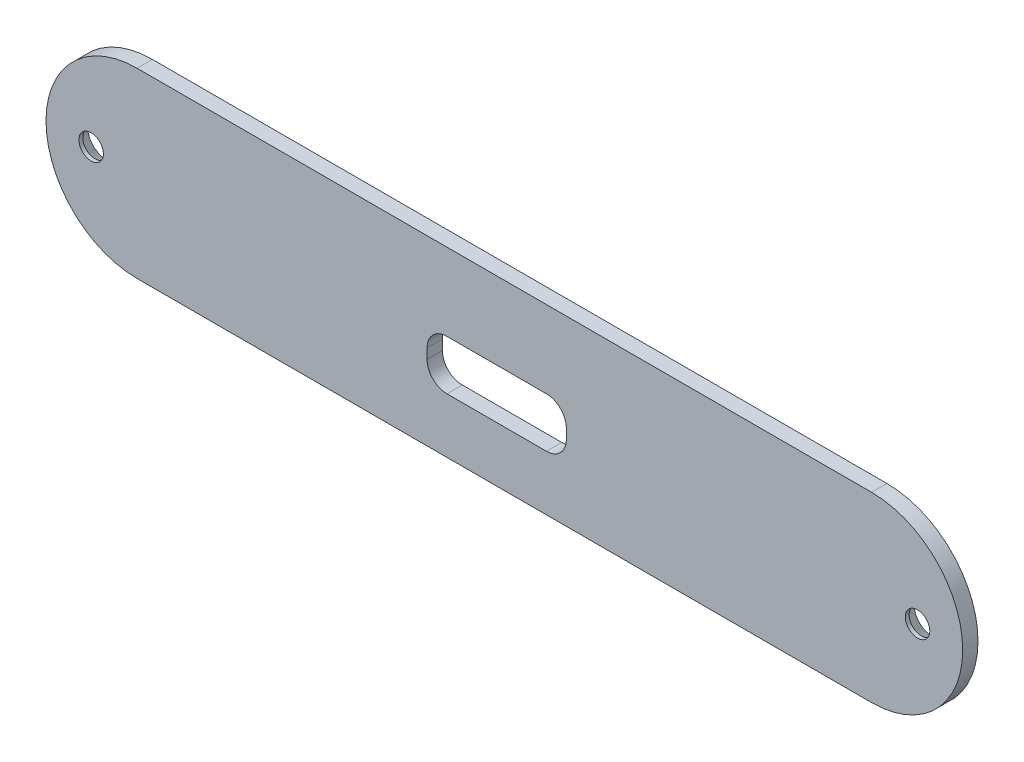
ISO-10303-21;
HEADER;
FILE_DESCRIPTION(('STEP AP214'),'2;1');
FILE_NAME('part.step','',(''),(''),'','','');
FILE_SCHEMA(('AUTOMOTIVE_DESIGN { 1 0 10303 214 1 1 1 1 }'));
ENDSEC;
DATA;
#1=APPLICATION_CONTEXT('core data for automotive mechanical design processes');
#2=APPLICATION_PROTOCOL_DEFINITION('international standard','automotive_design',2000,#1);
#3=PRODUCT_CONTEXT('',#1,'mechanical');
#4=PRODUCT('Part','Part','',(#3));
#5=PRODUCT_RELATED_PRODUCT_CATEGORY('part','',(#4));
#6=PRODUCT_DEFINITION_FORMATION('','',#4);
#7=PRODUCT_DEFINITION_CONTEXT('part definition',#1,'design');
#8=PRODUCT_DEFINITION('design','',#6,#7);
#9=PRODUCT_DEFINITION_SHAPE('','',#8);
#10=(LENGTH_UNIT() NAMED_UNIT(*) SI_UNIT(.MILLI.,.METRE.));
#11=(NAMED_UNIT(*) PLANE_ANGLE_UNIT() SI_UNIT($,.RADIAN.));
#12=(NAMED_UNIT(*) SI_UNIT($,.STERADIAN.) SOLID_ANGLE_UNIT());
#13=UNCERTAINTY_MEASURE_WITH_UNIT(LENGTH_MEASURE(1.E-05),#10,'distance_accuracy_value','');
#14=(GEOMETRIC_REPRESENTATION_CONTEXT(3) GLOBAL_UNCERTAINTY_ASSIGNED_CONTEXT((#13)) GLOBAL_UNIT_ASSIGNED_CONTEXT((#10,
#11,#12)) REPRESENTATION_CONTEXT('',''));
#15=CARTESIAN_POINT('',(0.,0.,0.));
#16=DIRECTION('',(0.,0.,1.));
#17=DIRECTION('',(1.,0.,0.));
#18=AXIS2_PLACEMENT_3D('',#15,#16,#17);
#19=CARTESIAN_POINT('',(24.,0.,1.));
#20=DIRECTION('',(0.,0.,-1.));
#21=DIRECTION('',(-1.,0.,0.));
#22=AXIS2_PLACEMENT_3D('',#19,#20,#21);
#23=CYLINDRICAL_SURFACE('',#22,5.95);
#24=CARTESIAN_POINT('',(24.,0.,0.));
#25=DIRECTION('',(0.,0.,1.));
#26=DIRECTION('',(1.,0.,0.));
#27=AXIS2_PLACEMENT_3D('',#24,#25,#26);
#28=CIRCLE('',#27,5.95);
#29=CARTESIAN_POINT('',(24.,-5.94999999999999,0.));
#30=VERTEX_POINT('',#29);
#31=CARTESIAN_POINT('',(24.,5.95000000000002,0.));
#32=VERTEX_POINT('',#31);
#33=EDGE_CURVE('E155',#30,#32,#28,.T.);
#34=ORIENTED_EDGE('',*,*,#33,.T.);
#35=DIRECTION('',(0.,0.,-1.));
#36=VECTOR('',#35,1.);
#37=CARTESIAN_POINT('',(24.,5.95000000000002,1.));
#38=LINE('',#37,#36);
#39=CARTESIAN_POINT('',(24.,5.95000000000002,1.));
#40=VERTEX_POINT('',#39);
#41=EDGE_CURVE('E136',#40,#32,#38,.T.);
#42=ORIENTED_EDGE('',*,*,#41,.F.);
#43=CARTESIAN_POINT('',(24.,0.,1.));
#44=DIRECTION('',(0.,0.,1.));
#45=DIRECTION('',(1.,0.,0.));
#46=AXIS2_PLACEMENT_3D('',#43,#44,#45);
#47=CIRCLE('',#46,5.95);
#48=CARTESIAN_POINT('',(24.,-5.94999999999999,1.));
#49=VERTEX_POINT('',#48);
#50=EDGE_CURVE('E143',#49,#40,#47,.T.);
#51=ORIENTED_EDGE('',*,*,#50,.F.);
#52=DIRECTION('',(0.,0.,-1.));
#53=VECTOR('',#52,1.);
#54=CARTESIAN_POINT('',(24.,-5.94999999999999,1.));
#55=LINE('',#54,#53);
#56=EDGE_CURVE('E241',#49,#30,#55,.T.);
#57=ORIENTED_EDGE('',*,*,#56,.T.);
#58=EDGE_LOOP('',(#34,#42,#51,#57));
#59=FACE_BOUND('',#58,.T.);
#60=ADVANCED_FACE('F41',(#59),#23,.T.);
#61=CARTESIAN_POINT('',(24.,5.95000000000002,1.));
#62=DIRECTION('',(0.,-1.,0.));
#63=DIRECTION('',(1.,0.,0.));
#64=AXIS2_PLACEMENT_3D('',#61,#62,#63);
#65=PLANE('',#64);
#66=DIRECTION('',(-1.,0.,0.));
#67=VECTOR('',#66,1.);
#68=CARTESIAN_POINT('',(24.,5.95000000000002,0.));
#69=LINE('',#68,#67);
#70=CARTESIAN_POINT('',(-24.,5.95,0.));
#71=VERTEX_POINT('',#70);
#72=EDGE_CURVE('E227',#32,#71,#69,.T.);
#73=ORIENTED_EDGE('',*,*,#72,.T.);
#74=DIRECTION('',(0.,0.,-1.));
#75=VECTOR('',#74,1.);
#76=CARTESIAN_POINT('',(-24.,5.95,1.));
#77=LINE('',#76,#75);
#78=CARTESIAN_POINT('',(-24.,5.95,1.));
#79=VERTEX_POINT('',#78);
#80=EDGE_CURVE('E139',#79,#71,#77,.T.);
#81=ORIENTED_EDGE('',*,*,#80,.F.);
#82=DIRECTION('',(-1.,0.,0.));
#83=VECTOR('',#82,1.);
#84=CARTESIAN_POINT('',(24.,5.95000000000002,1.));
#85=LINE('',#84,#83);
#86=EDGE_CURVE('E132',#40,#79,#85,.T.);
#87=ORIENTED_EDGE('',*,*,#86,.F.);
#88=ORIENTED_EDGE('',*,*,#41,.T.);
#89=EDGE_LOOP('',(#73,#81,#87,#88));
#90=FACE_BOUND('',#89,.T.);
#91=ADVANCED_FACE('F134',(#90),#65,.F.);
#92=CARTESIAN_POINT('',(-24.,0.,1.));
#93=DIRECTION('',(0.,0.,-1.));
#94=DIRECTION('',(-1.,0.,0.));
#95=AXIS2_PLACEMENT_3D('',#92,#93,#94);
#96=CYLINDRICAL_SURFACE('',#95,5.95);
#97=CARTESIAN_POINT('',(-24.,0.,0.));
#98=DIRECTION('',(0.,0.,1.));
#99=DIRECTION('',(1.,0.,0.));
#100=AXIS2_PLACEMENT_3D('',#97,#98,#99);
#101=CIRCLE('',#100,5.95);
#102=CARTESIAN_POINT('',(-24.,-5.95,0.));
#103=VERTEX_POINT('',#102);
#104=EDGE_CURVE('E231',#71,#103,#101,.T.);
#105=ORIENTED_EDGE('',*,*,#104,.T.);
#106=DIRECTION('',(0.,0.,-1.));
#107=VECTOR('',#106,1.);
#108=CARTESIAN_POINT('',(-24.,-5.95,1.));
#109=LINE('',#108,#107);
#110=CARTESIAN_POINT('',(-24.,-5.95,1.));
#111=VERTEX_POINT('',#110);
#112=EDGE_CURVE('E160',#111,#103,#109,.T.);
#113=ORIENTED_EDGE('',*,*,#112,.F.);
#114=CARTESIAN_POINT('',(-24.,0.,1.));
#115=DIRECTION('',(0.,0.,1.));
#116=DIRECTION('',(1.,0.,0.));
#117=AXIS2_PLACEMENT_3D('',#114,#115,#116);
#118=CIRCLE('',#117,5.95);
#119=EDGE_CURVE('E142',#79,#111,#118,.T.);
#120=ORIENTED_EDGE('',*,*,#119,.F.);
#121=ORIENTED_EDGE('',*,*,#80,.T.);
#122=EDGE_LOOP('',(#105,#113,#120,#121));
#123=FACE_BOUND('',#122,.T.);
#124=ADVANCED_FACE('F247',(#123),#96,.T.);
#125=CARTESIAN_POINT('',(-24.,-5.95,1.));
#126=DIRECTION('',(0.,1.,0.));
#127=DIRECTION('',(-1.,0.,0.));
#128=AXIS2_PLACEMENT_3D('',#125,#126,#127);
#129=PLANE('',#128);
#130=DIRECTION('',(1.,0.,0.));
#131=VECTOR('',#130,1.);
#132=CARTESIAN_POINT('',(-24.,-5.95,0.));
#133=LINE('',#132,#131);
#134=EDGE_CURVE('E152',#103,#30,#133,.T.);
#135=ORIENTED_EDGE('',*,*,#134,.T.);
#136=ORIENTED_EDGE('',*,*,#56,.F.);
#137=DIRECTION('',(1.,0.,0.));
#138=VECTOR('',#137,1.);
#139=CARTESIAN_POINT('',(-24.,-5.95,1.));
#140=LINE('',#139,#138);
#141=EDGE_CURVE('E148',#111,#49,#140,.T.);
#142=ORIENTED_EDGE('',*,*,#141,.F.);
#143=ORIENTED_EDGE('',*,*,#112,.T.);
#144=EDGE_LOOP('',(#135,#136,#142,#143));
#145=FACE_BOUND('',#144,.T.);
#146=ADVANCED_FACE('F245',(#145),#129,.F.);
#147=CARTESIAN_POINT('',(24.,0.,1.));
#148=DIRECTION('',(0.,0.,1.));
#149=DIRECTION('',(1.,0.,0.));
#150=AXIS2_PLACEMENT_3D('',#147,#148,#149);
#151=PLANE('',#150);
#152=DIRECTION('',(1.,0.,0.));
#153=VECTOR('',#152,1.);
#154=CARTESIAN_POINT('',(4.05,0.900000000000015,1.));
#155=LINE('',#154,#153);
#156=CARTESIAN_POINT('',(-3.75,0.900000000000015,1.));
#157=VERTEX_POINT('',#156);
#158=CARTESIAN_POINT('',(2.75,0.900000000000015,1.));
#159=VERTEX_POINT('',#158);
#160=EDGE_CURVE('E251',#157,#159,#155,.T.);
#161=ORIENTED_EDGE('',*,*,#160,.T.);
#162=CARTESIAN_POINT('',(2.75,-0.399999999999985,1.));
#163=DIRECTION('',(0.,0.,1.));
#164=DIRECTION('',(1.,0.,0.));
#165=AXIS2_PLACEMENT_3D('',#162,#163,#164);
#166=CIRCLE('',#165,1.3);
#167=CARTESIAN_POINT('',(4.05,-0.399999999999985,1.));
#168=VERTEX_POINT('',#167);
#169=EDGE_CURVE('E182',#159,#168,#166,.F.);
#170=ORIENTED_EDGE('',*,*,#169,.T.);
#171=DIRECTION('',(0.,-1.,0.));
#172=VECTOR('',#171,1.);
#173=CARTESIAN_POINT('',(4.05,-2.34999999999998,1.));
#174=LINE('',#173,#172);
#175=CARTESIAN_POINT('',(4.05,-1.04999999999998,1.));
#176=VERTEX_POINT('',#175);
#177=EDGE_CURVE('E255',#168,#176,#174,.T.);
#178=ORIENTED_EDGE('',*,*,#177,.T.);
#179=CARTESIAN_POINT('',(2.75,-1.04999999999998,1.));
#180=DIRECTION('',(0.,0.,1.));
#181=DIRECTION('',(1.,0.,0.));
#182=AXIS2_PLACEMENT_3D('',#179,#180,#181);
#183=CIRCLE('',#182,1.3);
#184=CARTESIAN_POINT('',(2.75,-2.34999999999998,1.));
#185=VERTEX_POINT('',#184);
#186=EDGE_CURVE('E63',#176,#185,#183,.F.);
#187=ORIENTED_EDGE('',*,*,#186,.T.);
#188=DIRECTION('',(-1.,0.,0.));
#189=VECTOR('',#188,1.);
#190=CARTESIAN_POINT('',(4.05,-2.34999999999998,1.));
#191=LINE('',#190,#189);
#192=CARTESIAN_POINT('',(-3.75,-2.34999999999998,1.));
#193=VERTEX_POINT('',#192);
#194=EDGE_CURVE('E268',#185,#193,#191,.T.);
#195=ORIENTED_EDGE('',*,*,#194,.T.);
#196=CARTESIAN_POINT('',(-3.75,-1.04999999999998,1.));
#197=DIRECTION('',(0.,0.,1.));
#198=DIRECTION('',(1.,0.,0.));
#199=AXIS2_PLACEMENT_3D('',#196,#197,#198);
#200=CIRCLE('',#199,1.3);
#201=CARTESIAN_POINT('',(-5.05,-1.04999999999999,1.));
#202=VERTEX_POINT('',#201);
#203=EDGE_CURVE('E193',#193,#202,#200,.F.);
#204=ORIENTED_EDGE('',*,*,#203,.T.);
#205=DIRECTION('',(0.,1.,0.));
#206=VECTOR('',#205,1.);
#207=CARTESIAN_POINT('',(-5.05,-2.34999999999998,1.));
#208=LINE('',#207,#206);
#209=CARTESIAN_POINT('',(-5.05,-0.399999999999986,1.));
#210=VERTEX_POINT('',#209);
#211=EDGE_CURVE('E265',#202,#210,#208,.T.);
#212=ORIENTED_EDGE('',*,*,#211,.T.);
#213=CARTESIAN_POINT('',(-3.75,-0.399999999999985,1.));
#214=DIRECTION('',(0.,0.,1.));
#215=DIRECTION('',(1.,0.,0.));
#216=AXIS2_PLACEMENT_3D('',#213,#214,#215);
#217=CIRCLE('',#216,1.3);
#218=EDGE_CURVE('E186',#210,#157,#217,.F.);
#219=ORIENTED_EDGE('',*,*,#218,.T.);
#220=EDGE_LOOP('',(#161,#170,#178,#187,#195,#204,#212,#219));
#221=FACE_BOUND('',#220,.T.);
#222=CARTESIAN_POINT('',(27.,0.,1.));
#223=DIRECTION('',(0.,0.,1.));
#224=DIRECTION('',(1.,0.,0.));
#225=AXIS2_PLACEMENT_3D('',#222,#223,#224);
#226=CIRCLE('',#225,0.799999999999999);
#227=CARTESIAN_POINT('',(27.8,0.,1.));
#228=VERTEX_POINT('',#227);
#229=EDGE_CURVE('E234',#228,#228,#226,.T.);
#230=ORIENTED_EDGE('',*,*,#229,.F.);
#231=EDGE_LOOP('',(#230));
#232=FACE_BOUND('',#231,.T.);
#233=CARTESIAN_POINT('',(-27.,0.,1.));
#234=DIRECTION('',(0.,0.,1.));
#235=DIRECTION('',(1.,0.,0.));
#236=AXIS2_PLACEMENT_3D('',#233,#234,#235);
#237=CIRCLE('',#236,0.799999999999999);
#238=CARTESIAN_POINT('',(-26.2,0.,1.));
#239=VERTEX_POINT('',#238);
#240=EDGE_CURVE('E229',#239,#239,#237,.T.);
#241=ORIENTED_EDGE('',*,*,#240,.F.);
#242=EDGE_LOOP('',(#241));
#243=FACE_BOUND('',#242,.T.);
#244=ORIENTED_EDGE('',*,*,#50,.T.);
#245=ORIENTED_EDGE('',*,*,#86,.T.);
#246=ORIENTED_EDGE('',*,*,#119,.T.);
#247=ORIENTED_EDGE('',*,*,#141,.T.);
#248=EDGE_LOOP('',(#244,#245,#246,#247));
#249=FACE_BOUND('',#248,.T.);
#250=ADVANCED_FACE('F146',(#221,#232,#243,#249),#151,.T.);
#251=CARTESIAN_POINT('',(24.,0.,0.));
#252=DIRECTION('',(0.,0.,1.));
#253=DIRECTION('',(1.,0.,0.));
#254=AXIS2_PLACEMENT_3D('',#251,#252,#253);
#255=PLANE('',#254);
#256=CARTESIAN_POINT('',(27.,0.,0.));
#257=DIRECTION('',(0.,0.,1.));
#258=DIRECTION('',(1.,0.,0.));
#259=AXIS2_PLACEMENT_3D('',#256,#257,#258);
#260=CIRCLE('',#259,1.23301270189221);
#261=CARTESIAN_POINT('',(28.2330127018922,0.,0.));
#262=VERTEX_POINT('',#261);
#263=EDGE_CURVE('E198',#262,#262,#260,.T.);
#264=ORIENTED_EDGE('',*,*,#263,.T.);
#265=EDGE_LOOP('',(#264));
#266=FACE_BOUND('',#265,.T.);
#267=CARTESIAN_POINT('',(-27.,0.,0.));
#268=DIRECTION('',(0.,0.,1.));
#269=DIRECTION('',(1.,0.,0.));
#270=AXIS2_PLACEMENT_3D('',#267,#268,#269);
#271=CIRCLE('',#270,1.23301270189221);
#272=CARTESIAN_POINT('',(-25.7669872981078,0.,0.));
#273=VERTEX_POINT('',#272);
#274=EDGE_CURVE('E195',#273,#273,#271,.T.);
#275=ORIENTED_EDGE('',*,*,#274,.T.);
#276=EDGE_LOOP('',(#275));
#277=FACE_BOUND('',#276,.T.);
#278=DIRECTION('',(-1.,0.,0.));
#279=VECTOR('',#278,1.);
#280=CARTESIAN_POINT('',(4.05,-2.34999999999998,0.));
#281=LINE('',#280,#279);
#282=CARTESIAN_POINT('',(2.75,-2.34999999999998,0.));
#283=VERTEX_POINT('',#282);
#284=CARTESIAN_POINT('',(-3.75,-2.34999999999998,0.));
#285=VERTEX_POINT('',#284);
#286=EDGE_CURVE('E224',#283,#285,#281,.T.);
#287=ORIENTED_EDGE('',*,*,#286,.F.);
#288=CARTESIAN_POINT('',(2.75,-1.04999999999998,0.));
#289=DIRECTION('',(0.,0.,1.));
#290=DIRECTION('',(1.,0.,0.));
#291=AXIS2_PLACEMENT_3D('',#288,#289,#290);
#292=CIRCLE('',#291,1.3);
#293=CARTESIAN_POINT('',(4.05,-1.04999999999998,0.));
#294=VERTEX_POINT('',#293);
#295=EDGE_CURVE('E188',#283,#294,#292,.T.);
#296=ORIENTED_EDGE('',*,*,#295,.T.);
#297=DIRECTION('',(0.,-1.,0.));
#298=VECTOR('',#297,1.);
#299=CARTESIAN_POINT('',(4.05,-2.34999999999998,0.));
#300=LINE('',#299,#298);
#301=CARTESIAN_POINT('',(4.05,-0.399999999999985,0.));
#302=VERTEX_POINT('',#301);
#303=EDGE_CURVE('E260',#302,#294,#300,.T.);
#304=ORIENTED_EDGE('',*,*,#303,.F.);
#305=CARTESIAN_POINT('',(2.75,-0.399999999999985,0.));
#306=DIRECTION('',(0.,0.,1.));
#307=DIRECTION('',(1.,0.,0.));
#308=AXIS2_PLACEMENT_3D('',#305,#306,#307);
#309=CIRCLE('',#308,1.3);
#310=CARTESIAN_POINT('',(2.75,0.900000000000015,0.));
#311=VERTEX_POINT('',#310);
#312=EDGE_CURVE('E180',#302,#311,#309,.T.);
#313=ORIENTED_EDGE('',*,*,#312,.T.);
#314=DIRECTION('',(1.,0.,0.));
#315=VECTOR('',#314,1.);
#316=CARTESIAN_POINT('',(4.05,0.900000000000015,0.));
#317=LINE('',#316,#315);
#318=CARTESIAN_POINT('',(-3.75,0.900000000000015,0.));
#319=VERTEX_POINT('',#318);
#320=EDGE_CURVE('E252',#319,#311,#317,.T.);
#321=ORIENTED_EDGE('',*,*,#320,.F.);
#322=CARTESIAN_POINT('',(-3.75,-0.399999999999985,0.));
#323=DIRECTION('',(0.,0.,1.));
#324=DIRECTION('',(1.,0.,0.));
#325=AXIS2_PLACEMENT_3D('',#322,#323,#324);
#326=CIRCLE('',#325,1.3);
#327=CARTESIAN_POINT('',(-5.05,-0.399999999999986,0.));
#328=VERTEX_POINT('',#327);
#329=EDGE_CURVE('E184',#319,#328,#326,.T.);
#330=ORIENTED_EDGE('',*,*,#329,.T.);
#331=DIRECTION('',(0.,1.,0.));
#332=VECTOR('',#331,1.);
#333=CARTESIAN_POINT('',(-5.05,-2.34999999999998,0.));
#334=LINE('',#333,#332);
#335=CARTESIAN_POINT('',(-5.05,-1.04999999999999,0.));
#336=VERTEX_POINT('',#335);
#337=EDGE_CURVE('E256',#336,#328,#334,.T.);
#338=ORIENTED_EDGE('',*,*,#337,.F.);
#339=CARTESIAN_POINT('',(-3.75,-1.04999999999998,0.));
#340=DIRECTION('',(0.,0.,1.));
#341=DIRECTION('',(1.,0.,0.));
#342=AXIS2_PLACEMENT_3D('',#339,#340,#341);
#343=CIRCLE('',#342,1.3);
#344=EDGE_CURVE('E191',#336,#285,#343,.T.);
#345=ORIENTED_EDGE('',*,*,#344,.T.);
#346=EDGE_LOOP('',(#287,#296,#304,#313,#321,#330,#338,#345));
#347=FACE_BOUND('',#346,.T.);
#348=ORIENTED_EDGE('',*,*,#33,.F.);
#349=ORIENTED_EDGE('',*,*,#134,.F.);
#350=ORIENTED_EDGE('',*,*,#104,.F.);
#351=ORIENTED_EDGE('',*,*,#72,.F.);
#352=EDGE_LOOP('',(#348,#349,#350,#351));
#353=FACE_BOUND('',#352,.T.);
#354=ADVANCED_FACE('F215',(#266,#277,#347,#353),#255,.F.);
#355=CARTESIAN_POINT('',(-27.,0.,0.));
#356=DIRECTION('',(0.,0.,1.));
#357=DIRECTION('',(1.,0.,0.));
#358=AXIS2_PLACEMENT_3D('',#355,#356,#357);
#359=CYLINDRICAL_SURFACE('',#358,0.799999999999999);
#360=CARTESIAN_POINT('',(-27.,0.,0.749999999999995));
#361=DIRECTION('',(0.,0.,1.));
#362=DIRECTION('',(1.,0.,0.));
#363=AXIS2_PLACEMENT_3D('',#360,#361,#362);
#364=CIRCLE('',#363,0.799999999999999);
#365=CARTESIAN_POINT('',(-26.2,0.,0.749999999999995));
#366=VERTEX_POINT('',#365);
#367=EDGE_CURVE('E11',#366,#366,#364,.F.);
#368=ORIENTED_EDGE('',*,*,#367,.T.);
#369=EDGE_LOOP('',(#368));
#370=FACE_BOUND('',#369,.T.);
#371=ORIENTED_EDGE('',*,*,#240,.T.);
#372=EDGE_LOOP('',(#371));
#373=FACE_BOUND('',#372,.T.);
#374=ADVANCED_FACE('F218',(#370,#373),#359,.F.);
#375=CARTESIAN_POINT('',(27.,0.,0.));
#376=DIRECTION('',(0.,0.,1.));
#377=DIRECTION('',(1.,0.,0.));
#378=AXIS2_PLACEMENT_3D('',#375,#376,#377);
#379=CYLINDRICAL_SURFACE('',#378,0.799999999999999);
#380=CARTESIAN_POINT('',(27.,0.,0.749999999999995));
#381=DIRECTION('',(0.,0.,1.));
#382=DIRECTION('',(1.,0.,0.));
#383=AXIS2_PLACEMENT_3D('',#380,#381,#382);
#384=CIRCLE('',#383,0.799999999999999);
#385=CARTESIAN_POINT('',(27.8,0.,0.749999999999995));
#386=VERTEX_POINT('',#385);
#387=EDGE_CURVE('E49',#386,#386,#384,.F.);
#388=ORIENTED_EDGE('',*,*,#387,.T.);
#389=EDGE_LOOP('',(#388));
#390=FACE_BOUND('',#389,.T.);
#391=ORIENTED_EDGE('',*,*,#229,.T.);
#392=EDGE_LOOP('',(#391));
#393=FACE_BOUND('',#392,.T.);
#394=ADVANCED_FACE('F206',(#390,#393),#379,.F.);
#395=CARTESIAN_POINT('',(4.05,-2.34999999999998,1.));
#396=DIRECTION('',(1.,0.,0.));
#397=DIRECTION('',(0.,0.,-1.));
#398=AXIS2_PLACEMENT_3D('',#395,#396,#397);
#399=PLANE('',#398);
#400=ORIENTED_EDGE('',*,*,#177,.F.);
#401=DIRECTION('',(0.,0.,-1.));
#402=VECTOR('',#401,1.);
#403=CARTESIAN_POINT('',(4.05,-0.399999999999985,0.));
#404=LINE('',#403,#402);
#405=EDGE_CURVE('E158',#168,#302,#404,.T.);
#406=ORIENTED_EDGE('',*,*,#405,.T.);
#407=ORIENTED_EDGE('',*,*,#303,.T.);
#408=DIRECTION('',(0.,0.,-1.));
#409=VECTOR('',#408,1.);
#410=CARTESIAN_POINT('',(4.05,-1.04999999999998,1.));
#411=LINE('',#410,#409);
#412=EDGE_CURVE('E156',#294,#176,#411,.F.);
#413=ORIENTED_EDGE('',*,*,#412,.T.);
#414=EDGE_LOOP('',(#400,#406,#407,#413));
#415=FACE_BOUND('',#414,.T.);
#416=ADVANCED_FACE('F300',(#415),#399,.F.);
#417=CARTESIAN_POINT('',(4.05,0.900000000000015,1.));
#418=DIRECTION('',(0.,1.,0.));
#419=DIRECTION('',(0.,0.,1.));
#420=AXIS2_PLACEMENT_3D('',#417,#418,#419);
#421=PLANE('',#420);
#422=ORIENTED_EDGE('',*,*,#320,.T.);
#423=DIRECTION('',(0.,0.,-1.));
#424=VECTOR('',#423,1.);
#425=CARTESIAN_POINT('',(2.75,0.900000000000015,1.));
#426=LINE('',#425,#424);
#427=EDGE_CURVE('E169',#311,#159,#426,.F.);
#428=ORIENTED_EDGE('',*,*,#427,.T.);
#429=ORIENTED_EDGE('',*,*,#160,.F.);
#430=DIRECTION('',(0.,0.,-1.));
#431=VECTOR('',#430,1.);
#432=CARTESIAN_POINT('',(-3.75,0.900000000000015,0.));
#433=LINE('',#432,#431);
#434=EDGE_CURVE('E166',#157,#319,#433,.T.);
#435=ORIENTED_EDGE('',*,*,#434,.T.);
#436=EDGE_LOOP('',(#422,#428,#429,#435));
#437=FACE_BOUND('',#436,.T.);
#438=ADVANCED_FACE('F295',(#437),#421,.F.);
#439=CARTESIAN_POINT('',(-5.05,-2.34999999999998,1.));
#440=DIRECTION('',(-1.,0.,0.));
#441=DIRECTION('',(0.,-1.,0.));
#442=AXIS2_PLACEMENT_3D('',#439,#440,#441);
#443=PLANE('',#442);
#444=ORIENTED_EDGE('',*,*,#337,.T.);
#445=DIRECTION('',(0.,0.,-1.));
#446=VECTOR('',#445,1.);
#447=CARTESIAN_POINT('',(-5.05,-0.399999999999985,1.));
#448=LINE('',#447,#446);
#449=EDGE_CURVE('E174',#328,#210,#448,.F.);
#450=ORIENTED_EDGE('',*,*,#449,.T.);
#451=ORIENTED_EDGE('',*,*,#211,.F.);
#452=DIRECTION('',(0.,0.,-1.));
#453=VECTOR('',#452,1.);
#454=CARTESIAN_POINT('',(-5.05,-1.04999999999999,0.));
#455=LINE('',#454,#453);
#456=EDGE_CURVE('E171',#202,#336,#455,.T.);
#457=ORIENTED_EDGE('',*,*,#456,.T.);
#458=EDGE_LOOP('',(#444,#450,#451,#457));
#459=FACE_BOUND('',#458,.T.);
#460=ADVANCED_FACE('F286',(#459),#443,.F.);
#461=CARTESIAN_POINT('',(4.05,-2.34999999999998,1.));
#462=DIRECTION('',(0.,-1.,0.));
#463=DIRECTION('',(0.,0.,-1.));
#464=AXIS2_PLACEMENT_3D('',#461,#462,#463);
#465=PLANE('',#464);
#466=ORIENTED_EDGE('',*,*,#194,.F.);
#467=DIRECTION('',(0.,0.,-1.));
#468=VECTOR('',#467,1.);
#469=CARTESIAN_POINT('',(2.75,-2.34999999999998,0.));
#470=LINE('',#469,#468);
#471=EDGE_CURVE('E177',#185,#283,#470,.T.);
#472=ORIENTED_EDGE('',*,*,#471,.T.);
#473=ORIENTED_EDGE('',*,*,#286,.T.);
#474=DIRECTION('',(0.,0.,-1.));
#475=VECTOR('',#474,1.);
#476=CARTESIAN_POINT('',(-3.75,-2.34999999999998,1.));
#477=LINE('',#476,#475);
#478=EDGE_CURVE('E56',#285,#193,#477,.F.);
#479=ORIENTED_EDGE('',*,*,#478,.T.);
#480=EDGE_LOOP('',(#466,#472,#473,#479));
#481=FACE_BOUND('',#480,.T.);
#482=ADVANCED_FACE('F279',(#481),#465,.F.);
#483=CARTESIAN_POINT('',(2.75,-0.399999999999985,1.));
#484=DIRECTION('',(0.,0.,1.));
#485=DIRECTION('',(1.,0.,0.));
#486=AXIS2_PLACEMENT_3D('',#483,#484,#485);
#487=CYLINDRICAL_SURFACE('',#486,1.3);
#488=ORIENTED_EDGE('',*,*,#169,.F.);
#489=ORIENTED_EDGE('',*,*,#427,.F.);
#490=ORIENTED_EDGE('',*,*,#312,.F.);
#491=ORIENTED_EDGE('',*,*,#405,.F.);
#492=EDGE_LOOP('',(#488,#489,#490,#491));
#493=FACE_BOUND('',#492,.T.);
#494=ADVANCED_FACE('F298',(#493),#487,.F.);
#495=CARTESIAN_POINT('',(-3.75,-0.399999999999985,1.));
#496=DIRECTION('',(0.,0.,1.));
#497=DIRECTION('',(1.,0.,0.));
#498=AXIS2_PLACEMENT_3D('',#495,#496,#497);
#499=CYLINDRICAL_SURFACE('',#498,1.3);
#500=ORIENTED_EDGE('',*,*,#218,.F.);
#501=ORIENTED_EDGE('',*,*,#449,.F.);
#502=ORIENTED_EDGE('',*,*,#329,.F.);
#503=ORIENTED_EDGE('',*,*,#434,.F.);
#504=EDGE_LOOP('',(#500,#501,#502,#503));
#505=FACE_BOUND('',#504,.T.);
#506=ADVANCED_FACE('F292',(#505),#499,.F.);
#507=CARTESIAN_POINT('',(2.75,-1.04999999999998,1.));
#508=DIRECTION('',(0.,0.,1.));
#509=DIRECTION('',(1.,0.,0.));
#510=AXIS2_PLACEMENT_3D('',#507,#508,#509);
#511=CYLINDRICAL_SURFACE('',#510,1.3);
#512=ORIENTED_EDGE('',*,*,#186,.F.);
#513=ORIENTED_EDGE('',*,*,#412,.F.);
#514=ORIENTED_EDGE('',*,*,#295,.F.);
#515=ORIENTED_EDGE('',*,*,#471,.F.);
#516=EDGE_LOOP('',(#512,#513,#514,#515));
#517=FACE_BOUND('',#516,.T.);
#518=ADVANCED_FACE('F278',(#517),#511,.F.);
#519=CARTESIAN_POINT('',(-3.75,-1.04999999999998,1.));
#520=DIRECTION('',(0.,0.,1.));
#521=DIRECTION('',(1.,0.,0.));
#522=AXIS2_PLACEMENT_3D('',#519,#520,#521);
#523=CYLINDRICAL_SURFACE('',#522,1.3);
#524=ORIENTED_EDGE('',*,*,#203,.F.);
#525=ORIENTED_EDGE('',*,*,#478,.F.);
#526=ORIENTED_EDGE('',*,*,#344,.F.);
#527=ORIENTED_EDGE('',*,*,#456,.F.);
#528=EDGE_LOOP('',(#524,#525,#526,#527));
#529=FACE_BOUND('',#528,.T.);
#530=ADVANCED_FACE('F212',(#529),#523,.F.);
#531=CARTESIAN_POINT('',(27.,0.,0.));
#532=DIRECTION('',(0.,0.,-1.));
#533=DIRECTION('',(-1.,0.,0.));
#534=AXIS2_PLACEMENT_3D('',#531,#532,#533);
#535=CONICAL_SURFACE('',#534,1.23301270189221,0.523598775598293);
#536=ORIENTED_EDGE('',*,*,#387,.F.);
#537=EDGE_LOOP('',(#536));
#538=FACE_BOUND('',#537,.T.);
#539=ORIENTED_EDGE('',*,*,#263,.F.);
#540=EDGE_LOOP('',(#539));
#541=FACE_BOUND('',#540,.T.);
#542=ADVANCED_FACE('F209',(#538,#541),#535,.F.);
#543=CARTESIAN_POINT('',(-27.,0.,0.));
#544=DIRECTION('',(0.,0.,-1.));
#545=DIRECTION('',(-1.,0.,0.));
#546=AXIS2_PLACEMENT_3D('',#543,#544,#545);
#547=CONICAL_SURFACE('',#546,1.23301270189221,0.523598775598293);
#548=ORIENTED_EDGE('',*,*,#367,.F.);
#549=EDGE_LOOP('',(#548));
#550=FACE_BOUND('',#549,.T.);
#551=ORIENTED_EDGE('',*,*,#274,.F.);
#552=EDGE_LOOP('',(#551));
#553=FACE_BOUND('',#552,.T.);
#554=ADVANCED_FACE('F43',(#550,#553),#547,.F.);
#555=CLOSED_SHELL('',(#60,#91,#124,#146,#250,#354,#374,#394,#416,#438,#460,#482,#494,#506,#518,
#530,#542,#554));
#556=MANIFOLD_SOLID_BREP('B2',#555);
#557=ADVANCED_BREP_SHAPE_REPRESENTATION('',(#18,#556),#14);
#558=SHAPE_DEFINITION_REPRESENTATION(#9,#557);
ENDSEC;
END-ISO-10303-21;
